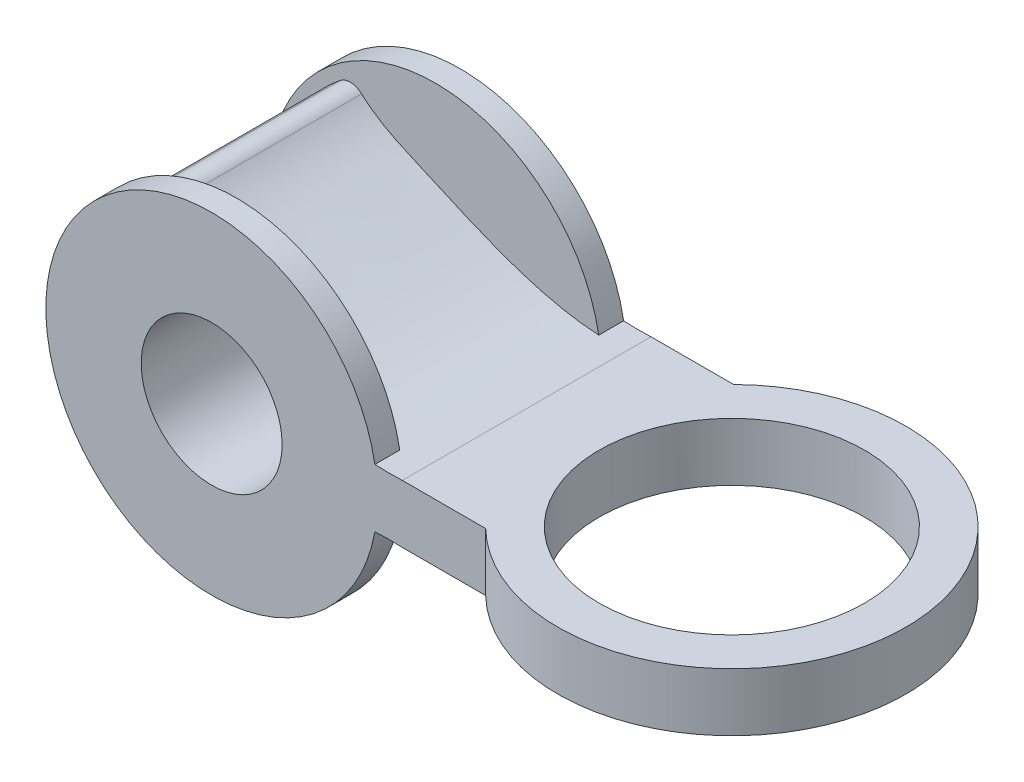
ISO-10303-21;
HEADER;
FILE_DESCRIPTION(('STEP AP214'),'2;1');
FILE_NAME('part.step','',(''),(''),'','','');
FILE_SCHEMA(('AUTOMOTIVE_DESIGN { 1 0 10303 214 1 1 1 1 }'));
ENDSEC;
DATA;
#1=APPLICATION_CONTEXT('core data for automotive mechanical design processes');
#2=APPLICATION_PROTOCOL_DEFINITION('international standard','automotive_design',2000,#1);
#3=PRODUCT_CONTEXT('',#1,'mechanical');
#4=PRODUCT('Part','Part','',(#3));
#5=PRODUCT_RELATED_PRODUCT_CATEGORY('part','',(#4));
#6=PRODUCT_DEFINITION_FORMATION('','',#4);
#7=PRODUCT_DEFINITION_CONTEXT('part definition',#1,'design');
#8=PRODUCT_DEFINITION('design','',#6,#7);
#9=PRODUCT_DEFINITION_SHAPE('','',#8);
#10=(LENGTH_UNIT() NAMED_UNIT(*) SI_UNIT(.MILLI.,.METRE.));
#11=(NAMED_UNIT(*) PLANE_ANGLE_UNIT() SI_UNIT($,.RADIAN.));
#12=(NAMED_UNIT(*) SI_UNIT($,.STERADIAN.) SOLID_ANGLE_UNIT());
#13=UNCERTAINTY_MEASURE_WITH_UNIT(LENGTH_MEASURE(1.E-05),#10,'distance_accuracy_value','');
#14=(GEOMETRIC_REPRESENTATION_CONTEXT(3) GLOBAL_UNCERTAINTY_ASSIGNED_CONTEXT((#13)) GLOBAL_UNIT_ASSIGNED_CONTEXT((#10,
#11,#12)) REPRESENTATION_CONTEXT('',''));
#15=CARTESIAN_POINT('',(0.,0.,0.));
#16=DIRECTION('',(0.,0.,1.));
#17=DIRECTION('',(1.,0.,0.));
#18=AXIS2_PLACEMENT_3D('',#15,#16,#17);
#19=CARTESIAN_POINT('',(0.,0.,-30.));
#20=DIRECTION('',(0.,0.,1.));
#21=DIRECTION('',(1.,0.,0.));
#22=AXIS2_PLACEMENT_3D('',#19,#20,#21);
#23=CYLINDRICAL_SURFACE('',#22,18.5332451256468);
#24=DIRECTION('',(0.,0.,1.));
#25=VECTOR('',#24,1.);
#26=CARTESIAN_POINT('',(-11.5154736588882,14.5215371534409,-30.));
#27=LINE('',#26,#25);
#28=CARTESIAN_POINT('',(-11.5154736588882,14.5215371534409,-3.));
#29=VERTEX_POINT('',#28);
#30=CARTESIAN_POINT('',(-11.5154736588882,14.5215371534409,-27.));
#31=VERTEX_POINT('',#30);
#32=EDGE_CURVE('E226',#29,#31,#27,.F.);
#33=ORIENTED_EDGE('',*,*,#32,.T.);
#34=CARTESIAN_POINT('',(0.,0.,-27.));
#35=DIRECTION('',(0.,0.,-1.));
#36=DIRECTION('',(-1.,0.,0.));
#37=AXIS2_PLACEMENT_3D('',#34,#35,#36);
#38=CIRCLE('',#37,18.5332451256468);
#39=CARTESIAN_POINT('',(-11.5154736588882,-14.5215371534409,-27.));
#40=VERTEX_POINT('',#39);
#41=EDGE_CURVE('E268',#31,#40,#38,.F.);
#42=ORIENTED_EDGE('',*,*,#41,.T.);
#43=DIRECTION('',(0.,0.,1.));
#44=VECTOR('',#43,1.);
#45=CARTESIAN_POINT('',(-11.5154736588882,-14.5215371534409,-30.));
#46=LINE('',#45,#44);
#47=CARTESIAN_POINT('',(-11.5154736588882,-14.5215371534409,-3.));
#48=VERTEX_POINT('',#47);
#49=EDGE_CURVE('E65',#40,#48,#46,.T.);
#50=ORIENTED_EDGE('',*,*,#49,.T.);
#51=CARTESIAN_POINT('',(0.,0.,-3.));
#52=DIRECTION('',(0.,0.,1.));
#53=DIRECTION('',(1.,0.,0.));
#54=AXIS2_PLACEMENT_3D('',#51,#52,#53);
#55=CIRCLE('',#54,18.5332451256468);
#56=EDGE_CURVE('E338',#29,#48,#55,.T.);
#57=ORIENTED_EDGE('',*,*,#56,.F.);
#58=EDGE_LOOP('',(#33,#42,#50,#57));
#59=FACE_BOUND('',#58,.T.);
#60=ADVANCED_FACE('F39',(#59),#23,.T.);
#61=CARTESIAN_POINT('',(-10.2727907309046,12.9544573403815,-16.5));
#62=DIRECTION('',(0.,0.,1.));
#63=DIRECTION('',(1.,0.,0.));
#64=AXIS2_PLACEMENT_3D('',#61,#62,#63);
#65=CYLINDRICAL_SURFACE('',#64,2.);
#66=DIRECTION('',(0.,0.,1.));
#67=VECTOR('',#66,1.);
#68=CARTESIAN_POINT('',(-8.90822627606835,14.416635116371,-30.));
#69=LINE('',#68,#67);
#70=CARTESIAN_POINT('',(-8.90822627606835,14.416635116371,-27.));
#71=VERTEX_POINT('',#70);
#72=CARTESIAN_POINT('',(-8.90822627606835,14.416635116371,-3.));
#73=VERTEX_POINT('',#72);
#74=EDGE_CURVE('E215',#71,#73,#69,.T.);
#75=ORIENTED_EDGE('',*,*,#74,.F.);
#76=CARTESIAN_POINT('',(-10.2727907309046,12.9544573403815,-27.));
#77=DIRECTION('',(0.,0.,-1.));
#78=DIRECTION('',(-1.,0.,0.));
#79=AXIS2_PLACEMENT_3D('',#76,#77,#78);
#80=CIRCLE('',#79,2.);
#81=EDGE_CURVE('E217',#71,#31,#80,.F.);
#82=ORIENTED_EDGE('',*,*,#81,.T.);
#83=ORIENTED_EDGE('',*,*,#32,.F.);
#84=CARTESIAN_POINT('',(-10.2727907309046,12.9544573403815,-3.));
#85=DIRECTION('',(0.,0.,1.));
#86=DIRECTION('',(1.,0.,0.));
#87=AXIS2_PLACEMENT_3D('',#84,#85,#86);
#88=CIRCLE('',#87,2.);
#89=EDGE_CURVE('E219',#73,#29,#88,.T.);
#90=ORIENTED_EDGE('',*,*,#89,.F.);
#91=EDGE_LOOP('',(#75,#82,#83,#90));
#92=FACE_BOUND('',#91,.T.);
#93=ADVANCED_FACE('F204',(#92),#65,.T.);
#94=CARTESIAN_POINT('',(-10.2727907309046,-12.9544573403816,-16.5));
#95=DIRECTION('',(0.,0.,1.));
#96=DIRECTION('',(1.,0.,0.));
#97=AXIS2_PLACEMENT_3D('',#94,#95,#96);
#98=CYLINDRICAL_SURFACE('',#97,2.);
#99=ORIENTED_EDGE('',*,*,#49,.F.);
#100=CARTESIAN_POINT('',(-10.2727907309046,-12.9544573403816,-27.));
#101=DIRECTION('',(0.,0.,-1.));
#102=DIRECTION('',(-1.,0.,0.));
#103=AXIS2_PLACEMENT_3D('',#100,#101,#102);
#104=CIRCLE('',#103,2.);
#105=CARTESIAN_POINT('',(-8.90822627606836,-14.416635116371,-27.));
#106=VERTEX_POINT('',#105);
#107=EDGE_CURVE('E11',#40,#106,#104,.F.);
#108=ORIENTED_EDGE('',*,*,#107,.T.);
#109=DIRECTION('',(0.,0.,1.));
#110=VECTOR('',#109,1.);
#111=CARTESIAN_POINT('',(-8.90822627606837,-14.416635116371,-3.));
#112=LINE('',#111,#110);
#113=CARTESIAN_POINT('',(-8.90822627606836,-14.416635116371,-3.));
#114=VERTEX_POINT('',#113);
#115=EDGE_CURVE('E235',#114,#106,#112,.F.);
#116=ORIENTED_EDGE('',*,*,#115,.F.);
#117=CARTESIAN_POINT('',(-10.2727907309046,-12.9544573403816,-3.));
#118=DIRECTION('',(0.,0.,1.));
#119=DIRECTION('',(1.,0.,0.));
#120=AXIS2_PLACEMENT_3D('',#117,#118,#119);
#121=CIRCLE('',#120,2.);
#122=EDGE_CURVE('E57',#48,#114,#121,.T.);
#123=ORIENTED_EDGE('',*,*,#122,.F.);
#124=EDGE_LOOP('',(#99,#108,#116,#123));
#125=FACE_BOUND('',#124,.T.);
#126=ADVANCED_FACE('F41',(#125),#98,.T.);
#127=CARTESIAN_POINT('',(0.,0.,-3.));
#128=DIRECTION('',(0.,0.,1.));
#129=DIRECTION('',(1.,0.,0.));
#130=AXIS2_PLACEMENT_3D('',#127,#128,#129);
#131=CYLINDRICAL_SURFACE('',#130,20.);
#132=DIRECTION('',(0.,0.,1.));
#133=VECTOR('',#132,1.);
#134=CARTESIAN_POINT('',(19.6880187341275,-3.51879501031881,-30.));
#135=LINE('',#134,#133);
#136=CARTESIAN_POINT('',(19.6880187341275,-3.51879501031881,0.));
#137=VERTEX_POINT('',#136);
#138=CARTESIAN_POINT('',(19.6880187341275,-3.51879501031881,-3.));
#139=VERTEX_POINT('',#138);
#140=EDGE_CURVE('E346',#137,#139,#135,.F.);
#141=ORIENTED_EDGE('',*,*,#140,.F.);
#142=CARTESIAN_POINT('',(0.,0.,0.));
#143=DIRECTION('',(0.,0.,1.));
#144=DIRECTION('',(1.,0.,0.));
#145=AXIS2_PLACEMENT_3D('',#142,#143,#144);
#146=CIRCLE('',#145,20.);
#147=CARTESIAN_POINT('',(19.6880187341275,3.51879501031881,0.));
#148=VERTEX_POINT('',#147);
#149=EDGE_CURVE('E229',#148,#137,#146,.T.);
#150=ORIENTED_EDGE('',*,*,#149,.F.);
#151=DIRECTION('',(0.,0.,1.));
#152=VECTOR('',#151,1.);
#153=CARTESIAN_POINT('',(19.6880187341275,3.51879501031881,-30.));
#154=LINE('',#153,#152);
#155=CARTESIAN_POINT('',(19.6880187341275,3.51879501031881,-3.));
#156=VERTEX_POINT('',#155);
#157=EDGE_CURVE('E332',#156,#148,#154,.T.);
#158=ORIENTED_EDGE('',*,*,#157,.F.);
#159=CARTESIAN_POINT('',(0.,0.,-3.));
#160=DIRECTION('',(0.,0.,1.));
#161=DIRECTION('',(1.,0.,0.));
#162=AXIS2_PLACEMENT_3D('',#159,#160,#161);
#163=CIRCLE('',#162,20.);
#164=EDGE_CURVE('E222',#156,#139,#163,.T.);
#165=ORIENTED_EDGE('',*,*,#164,.T.);
#166=EDGE_LOOP('',(#141,#150,#158,#165));
#167=FACE_BOUND('',#166,.T.);
#168=ADVANCED_FACE('F197',(#167),#131,.T.);
#169=CARTESIAN_POINT('',(0.,0.,-3.));
#170=DIRECTION('',(0.,0.,1.));
#171=DIRECTION('',(1.,0.,0.));
#172=AXIS2_PLACEMENT_3D('',#169,#170,#171);
#173=PLANE('',#172);
#174=CARTESIAN_POINT('',(22.9951896370363,3.5,-3.));
#175=CARTESIAN_POINT('',(13.8331554863839,3.05258589155144,-3.));
#176=CARTESIAN_POINT('',(3.18858359263504,8.31405084999522,-3.));
#177=CARTESIAN_POINT('',(-7.82011813479839,12.9045693588074,-3.));
#178=CARTESIAN_POINT('',(-10.0122596027287,15.596019765789,-3.));
#179=B_SPLINE_CURVE_WITH_KNOTS('',3,(#174,#175,#176,#177,#178),.UNSPECIFIED.,.F.,.F.,(4,1,4),
(0.,0.723511581759915,1.),.UNSPECIFIED.);
#180=EDGE_CURVE('E325',#156,#73,#179,.T.);
#181=ORIENTED_EDGE('',*,*,#180,.T.);
#182=ORIENTED_EDGE('',*,*,#89,.T.);
#183=ORIENTED_EDGE('',*,*,#56,.T.);
#184=ORIENTED_EDGE('',*,*,#122,.T.);
#185=CARTESIAN_POINT('',(-10.0122596027287,-15.596019765789,-3.));
#186=CARTESIAN_POINT('',(-7.82011813479838,-12.9045693588075,-3.));
#187=CARTESIAN_POINT('',(3.18858359263503,-8.31405084999522,-3.));
#188=CARTESIAN_POINT('',(13.8331554863839,-3.05258589155144,-3.));
#189=CARTESIAN_POINT('',(22.9951896370363,-3.5,-3.));
#190=B_SPLINE_CURVE_WITH_KNOTS('',3,(#185,#186,#187,#188,#189),.UNSPECIFIED.,.F.,.F.,(4,1,4),
(0.,0.276488418240085,1.),.UNSPECIFIED.);
#191=EDGE_CURVE('E341',#114,#139,#190,.T.);
#192=ORIENTED_EDGE('',*,*,#191,.T.);
#193=ORIENTED_EDGE('',*,*,#164,.F.);
#194=EDGE_LOOP('',(#181,#182,#183,#184,#192,#193));
#195=FACE_BOUND('',#194,.T.);
#196=ADVANCED_FACE('F193',(#195),#173,.F.);
#197=CARTESIAN_POINT('',(0.,0.,0.));
#198=DIRECTION('',(0.,0.,1.));
#199=DIRECTION('',(1.,0.,0.));
#200=AXIS2_PLACEMENT_3D('',#197,#198,#199);
#201=PLANE('',#200);
#202=CARTESIAN_POINT('',(0.,0.,0.));
#203=DIRECTION('',(0.,0.,1.));
#204=DIRECTION('',(1.,0.,0.));
#205=AXIS2_PLACEMENT_3D('',#202,#203,#204);
#206=CIRCLE('',#205,8.5);
#207=CARTESIAN_POINT('',(8.5,0.,0.));
#208=VERTEX_POINT('',#207);
#209=EDGE_CURVE('E247',#208,#208,#206,.T.);
#210=ORIENTED_EDGE('',*,*,#209,.F.);
#211=EDGE_LOOP('',(#210));
#212=FACE_BOUND('',#211,.T.);
#213=DIRECTION('',(0.,-1.,0.));
#214=VECTOR('',#213,1.);
#215=CARTESIAN_POINT('',(33.0496479144585,3.5,0.));
#216=LINE('',#215,#214);
#217=CARTESIAN_POINT('',(33.0496479144585,3.5,0.));
#218=VERTEX_POINT('',#217);
#219=CARTESIAN_POINT('',(33.0496479144585,-3.5,0.));
#220=VERTEX_POINT('',#219);
#221=EDGE_CURVE('E289',#218,#220,#216,.T.);
#222=ORIENTED_EDGE('',*,*,#221,.F.);
#223=DIRECTION('',(-1.,0.,0.));
#224=VECTOR('',#223,1.);
#225=CARTESIAN_POINT('',(22.9951896370363,3.5,0.));
#226=LINE('',#225,#224);
#227=CARTESIAN_POINT('',(22.9951896370363,3.5,0.));
#228=VERTEX_POINT('',#227);
#229=EDGE_CURVE('E293',#218,#228,#226,.T.);
#230=ORIENTED_EDGE('',*,*,#229,.T.);
#231=CARTESIAN_POINT('',(22.9951896370363,3.5,0.));
#232=CARTESIAN_POINT('',(13.8331554863839,3.05258589155144,0.));
#233=CARTESIAN_POINT('',(3.18858359263504,8.31405084999522,0.));
#234=CARTESIAN_POINT('',(-7.82011813479839,12.9045693588074,0.));
#235=CARTESIAN_POINT('',(-10.0122596027287,15.596019765789,0.));
#236=B_SPLINE_CURVE_WITH_KNOTS('',3,(#231,#232,#233,#234,#235),.UNSPECIFIED.,.F.,.F.,(4,1,4),
(0.,0.723511581759915,1.),.UNSPECIFIED.);
#237=EDGE_CURVE('E297',#228,#148,#236,.T.);
#238=ORIENTED_EDGE('',*,*,#237,.T.);
#239=ORIENTED_EDGE('',*,*,#149,.T.);
#240=CARTESIAN_POINT('',(-10.0122596027287,-15.596019765789,0.));
#241=CARTESIAN_POINT('',(-7.82011813479838,-12.9045693588075,0.));
#242=CARTESIAN_POINT('',(3.18858359263503,-8.31405084999522,0.));
#243=CARTESIAN_POINT('',(13.8331554863839,-3.05258589155144,0.));
#244=CARTESIAN_POINT('',(22.9951896370363,-3.5,0.));
#245=B_SPLINE_CURVE_WITH_KNOTS('',3,(#240,#241,#242,#243,#244),.UNSPECIFIED.,.F.,.F.,(4,1,4),
(0.,0.276488418240085,1.),.UNSPECIFIED.);
#246=CARTESIAN_POINT('',(22.9951896370363,-3.5,0.));
#247=VERTEX_POINT('',#246);
#248=EDGE_CURVE('E303',#137,#247,#245,.T.);
#249=ORIENTED_EDGE('',*,*,#248,.T.);
#250=DIRECTION('',(1.,0.,0.));
#251=VECTOR('',#250,1.);
#252=CARTESIAN_POINT('',(22.9951896370363,-3.5,0.));
#253=LINE('',#252,#251);
#254=EDGE_CURVE('E170',#247,#220,#253,.T.);
#255=ORIENTED_EDGE('',*,*,#254,.T.);
#256=EDGE_LOOP('',(#222,#230,#238,#239,#249,#255));
#257=FACE_BOUND('',#256,.T.);
#258=ADVANCED_FACE('F196',(#212,#257),#201,.T.);
#259=CARTESIAN_POINT('',(22.9951896370363,-3.5,-30.));
#260=DIRECTION('',(0.,-1.,0.));
#261=DIRECTION('',(1.,0.,0.));
#262=AXIS2_PLACEMENT_3D('',#259,#260,#261);
#263=PLANE('',#262);
#264=CARTESIAN_POINT('',(47.6997847970328,-3.5,-15.0457133204723));
#265=DIRECTION('',(0.,-1.,0.));
#266=DIRECTION('',(1.,0.,0.));
#267=AXIS2_PLACEMENT_3D('',#264,#265,#266);
#268=CIRCLE('',#267,16.);
#269=CARTESIAN_POINT('',(63.6997847970328,-3.5,-15.0457133204723));
#270=VERTEX_POINT('',#269);
#271=EDGE_CURVE('E257',#270,#270,#268,.T.);
#272=ORIENTED_EDGE('',*,*,#271,.F.);
#273=EDGE_LOOP('',(#272));
#274=FACE_BOUND('',#273,.T.);
#275=CARTESIAN_POINT('',(47.6997847970328,-3.5,-15.0457133204723));
#276=DIRECTION('',(0.,-1.,0.));
#277=DIRECTION('',(1.,0.,0.));
#278=AXIS2_PLACEMENT_3D('',#275,#276,#277);
#279=CIRCLE('',#278,21.);
#280=CARTESIAN_POINT('',(32.9563350682041,-3.5,-30.));
#281=VERTEX_POINT('',#280);
#282=EDGE_CURVE('E285',#281,#220,#279,.T.);
#283=ORIENTED_EDGE('',*,*,#282,.T.);
#284=ORIENTED_EDGE('',*,*,#254,.F.);
#285=DIRECTION('',(0.,0.,1.));
#286=VECTOR('',#285,1.);
#287=CARTESIAN_POINT('',(22.9951896370363,-3.5,-30.));
#288=LINE('',#287,#286);
#289=CARTESIAN_POINT('',(22.9951896370363,-3.5,-30.));
#290=VERTEX_POINT('',#289);
#291=EDGE_CURVE('E321',#290,#247,#288,.T.);
#292=ORIENTED_EDGE('',*,*,#291,.F.);
#293=DIRECTION('',(1.,0.,0.));
#294=VECTOR('',#293,1.);
#295=CARTESIAN_POINT('',(22.9951896370363,-3.5,-30.));
#296=LINE('',#295,#294);
#297=EDGE_CURVE('E168',#290,#281,#296,.T.);
#298=ORIENTED_EDGE('',*,*,#297,.T.);
#299=EDGE_LOOP('',(#283,#284,#292,#298));
#300=FACE_BOUND('',#299,.T.);
#301=ADVANCED_FACE('F200',(#274,#300),#263,.T.);
#302=CARTESIAN_POINT('',(-10.0122596027287,-15.596019765789,-30.));
#303=CARTESIAN_POINT('',(-7.82011813479838,-12.9045693588075,-30.));
#304=CARTESIAN_POINT('',(3.18858359263503,-8.31405084999522,-30.));
#305=CARTESIAN_POINT('',(13.8331554863839,-3.05258589155144,-30.));
#306=CARTESIAN_POINT('',(22.9951896370363,-3.5,-30.));
#307=B_SPLINE_CURVE_WITH_KNOTS('',3,(#302,#303,#304,#305,#306),.UNSPECIFIED.,.F.,.F.,(4,1,4),
(0.,0.276488418240085,1.),.UNSPECIFIED.);
#308=DIRECTION('',(0.,0.,1.));
#309=VECTOR('',#308,1.);
#310=SURFACE_OF_LINEAR_EXTRUSION('',#307,#309);
#311=DIRECTION('',(0.,0.,1.));
#312=VECTOR('',#311,1.);
#313=CARTESIAN_POINT('',(19.6880187341275,-3.51879501031881,-30.));
#314=LINE('',#313,#312);
#315=CARTESIAN_POINT('',(19.6880187341275,-3.51879501031881,-30.));
#316=VERTEX_POINT('',#315);
#317=CARTESIAN_POINT('',(19.6880187341275,-3.51879501031881,-27.));
#318=VERTEX_POINT('',#317);
#319=EDGE_CURVE('E144',#316,#318,#314,.T.);
#320=ORIENTED_EDGE('',*,*,#319,.F.);
#321=EDGE_CURVE('E154',#316,#290,#307,.T.);
#322=ORIENTED_EDGE('',*,*,#321,.T.);
#323=ORIENTED_EDGE('',*,*,#291,.T.);
#324=ORIENTED_EDGE('',*,*,#248,.F.);
#325=ORIENTED_EDGE('',*,*,#140,.T.);
#326=ORIENTED_EDGE('',*,*,#191,.F.);
#327=ORIENTED_EDGE('',*,*,#115,.T.);
#328=CARTESIAN_POINT('',(-10.0122596027287,-15.596019765789,-27.));
#329=CARTESIAN_POINT('',(-7.82011813479838,-12.9045693588075,-27.));
#330=CARTESIAN_POINT('',(3.18858359263503,-8.31405084999522,-27.));
#331=CARTESIAN_POINT('',(13.8331554863839,-3.05258589155144,-27.));
#332=CARTESIAN_POINT('',(22.9951896370363,-3.5,-27.));
#333=B_SPLINE_CURVE_WITH_KNOTS('',3,(#328,#329,#330,#331,#332),.UNSPECIFIED.,.F.,.F.,(4,1,4),
(0.,0.276488418240085,1.),.UNSPECIFIED.);
#334=EDGE_CURVE('E261',#106,#318,#333,.T.);
#335=ORIENTED_EDGE('',*,*,#334,.T.);
#336=EDGE_LOOP('',(#320,#322,#323,#324,#325,#326,#327,#335));
#337=FACE_BOUND('',#336,.T.);
#338=ADVANCED_FACE('F188',(#337),#310,.T.);
#339=CARTESIAN_POINT('',(22.9951896370363,3.5,-30.));
#340=CARTESIAN_POINT('',(13.8331554863839,3.05258589155144,-30.));
#341=CARTESIAN_POINT('',(3.18858359263504,8.31405084999522,-30.));
#342=CARTESIAN_POINT('',(-7.82011813479839,12.9045693588074,-30.));
#343=CARTESIAN_POINT('',(-10.0122596027287,15.596019765789,-30.));
#344=B_SPLINE_CURVE_WITH_KNOTS('',3,(#339,#340,#341,#342,#343),.UNSPECIFIED.,.F.,.F.,(4,1,4),
(0.,0.723511581759915,1.),.UNSPECIFIED.);
#345=DIRECTION('',(0.,0.,1.));
#346=VECTOR('',#345,1.);
#347=SURFACE_OF_LINEAR_EXTRUSION('',#344,#346);
#348=DIRECTION('',(0.,0.,1.));
#349=VECTOR('',#348,1.);
#350=CARTESIAN_POINT('',(19.6880187341275,3.51879501031881,-30.));
#351=LINE('',#350,#349);
#352=CARTESIAN_POINT('',(19.6880187341275,3.51879501031881,-27.));
#353=VERTEX_POINT('',#352);
#354=CARTESIAN_POINT('',(19.6880187341275,3.51879501031881,-30.));
#355=VERTEX_POINT('',#354);
#356=EDGE_CURVE('E133',#353,#355,#351,.F.);
#357=ORIENTED_EDGE('',*,*,#356,.F.);
#358=CARTESIAN_POINT('',(22.9951896370363,3.5,-27.));
#359=CARTESIAN_POINT('',(13.8331554863839,3.05258589155144,-27.));
#360=CARTESIAN_POINT('',(3.18858359263504,8.31405084999522,-27.));
#361=CARTESIAN_POINT('',(-7.82011813479839,12.9045693588074,-27.));
#362=CARTESIAN_POINT('',(-10.0122596027287,15.596019765789,-27.));
#363=B_SPLINE_CURVE_WITH_KNOTS('',3,(#358,#359,#360,#361,#362),.UNSPECIFIED.,.F.,.F.,(4,1,4),
(0.,0.723511581759915,1.),.UNSPECIFIED.);
#364=EDGE_CURVE('E145',#353,#71,#363,.T.);
#365=ORIENTED_EDGE('',*,*,#364,.T.);
#366=ORIENTED_EDGE('',*,*,#74,.T.);
#367=ORIENTED_EDGE('',*,*,#180,.F.);
#368=ORIENTED_EDGE('',*,*,#157,.T.);
#369=ORIENTED_EDGE('',*,*,#237,.F.);
#370=DIRECTION('',(0.,0.,1.));
#371=VECTOR('',#370,1.);
#372=CARTESIAN_POINT('',(22.9951896370363,3.5,-30.));
#373=LINE('',#372,#371);
#374=CARTESIAN_POINT('',(22.9951896370363,3.5,-30.));
#375=VERTEX_POINT('',#374);
#376=EDGE_CURVE('E162',#375,#228,#373,.T.);
#377=ORIENTED_EDGE('',*,*,#376,.F.);
#378=EDGE_CURVE('E152',#375,#355,#344,.T.);
#379=ORIENTED_EDGE('',*,*,#378,.T.);
#380=EDGE_LOOP('',(#357,#365,#366,#367,#368,#369,#377,#379));
#381=FACE_BOUND('',#380,.T.);
#382=ADVANCED_FACE('F159',(#381),#347,.T.);
#383=CARTESIAN_POINT('',(22.9951896370363,3.5,-30.));
#384=DIRECTION('',(0.,1.,0.));
#385=DIRECTION('',(0.,0.,1.));
#386=AXIS2_PLACEMENT_3D('',#383,#384,#385);
#387=PLANE('',#386);
#388=CARTESIAN_POINT('',(47.6997847970328,3.5,-15.0457133204723));
#389=DIRECTION('',(0.,1.,0.));
#390=DIRECTION('',(0.,0.,1.));
#391=AXIS2_PLACEMENT_3D('',#388,#389,#390);
#392=CIRCLE('',#391,16.);
#393=CARTESIAN_POINT('',(47.6997847970328,3.5,0.954286679527714));
#394=VERTEX_POINT('',#393);
#395=EDGE_CURVE('E43',#394,#394,#392,.T.);
#396=ORIENTED_EDGE('',*,*,#395,.F.);
#397=EDGE_LOOP('',(#396));
#398=FACE_BOUND('',#397,.T.);
#399=ORIENTED_EDGE('',*,*,#229,.F.);
#400=CARTESIAN_POINT('',(47.6997847970328,3.5,-15.0457133204723));
#401=DIRECTION('',(0.,-1.,0.));
#402=DIRECTION('',(1.,0.,0.));
#403=AXIS2_PLACEMENT_3D('',#400,#401,#402);
#404=CIRCLE('',#403,21.);
#405=CARTESIAN_POINT('',(32.9563350682041,3.5,-30.));
#406=VERTEX_POINT('',#405);
#407=EDGE_CURVE('E286',#406,#218,#404,.T.);
#408=ORIENTED_EDGE('',*,*,#407,.F.);
#409=DIRECTION('',(-1.,0.,0.));
#410=VECTOR('',#409,1.);
#411=CARTESIAN_POINT('',(22.9951896370363,3.5,-30.));
#412=LINE('',#411,#410);
#413=EDGE_CURVE('E164',#406,#375,#412,.T.);
#414=ORIENTED_EDGE('',*,*,#413,.T.);
#415=ORIENTED_EDGE('',*,*,#376,.T.);
#416=EDGE_LOOP('',(#399,#408,#414,#415));
#417=FACE_BOUND('',#416,.T.);
#418=ADVANCED_FACE('F187',(#398,#417),#387,.T.);
#419=CARTESIAN_POINT('',(5.54791951884021,-7.14755672666964,-30.));
#420=DIRECTION('',(0.,0.,1.));
#421=DIRECTION('',(1.,0.,0.));
#422=AXIS2_PLACEMENT_3D('',#419,#420,#421);
#423=PLANE('',#422);
#424=CARTESIAN_POINT('',(0.,0.,-30.));
#425=DIRECTION('',(0.,0.,1.));
#426=DIRECTION('',(1.,0.,0.));
#427=AXIS2_PLACEMENT_3D('',#424,#425,#426);
#428=CIRCLE('',#427,8.5);
#429=CARTESIAN_POINT('',(8.5,0.,-30.));
#430=VERTEX_POINT('',#429);
#431=EDGE_CURVE('E156',#430,#430,#428,.T.);
#432=ORIENTED_EDGE('',*,*,#431,.T.);
#433=EDGE_LOOP('',(#432));
#434=FACE_BOUND('',#433,.T.);
#435=ORIENTED_EDGE('',*,*,#321,.F.);
#436=CARTESIAN_POINT('',(0.,0.,-30.));
#437=DIRECTION('',(0.,0.,-1.));
#438=DIRECTION('',(-1.,0.,0.));
#439=AXIS2_PLACEMENT_3D('',#436,#437,#438);
#440=CIRCLE('',#439,20.);
#441=EDGE_CURVE('E136',#316,#355,#440,.T.);
#442=ORIENTED_EDGE('',*,*,#441,.T.);
#443=ORIENTED_EDGE('',*,*,#378,.F.);
#444=ORIENTED_EDGE('',*,*,#413,.F.);
#445=DIRECTION('',(0.,-1.,0.));
#446=VECTOR('',#445,1.);
#447=CARTESIAN_POINT('',(32.9563350682041,3.5,-30.));
#448=LINE('',#447,#446);
#449=EDGE_CURVE('E49',#406,#281,#448,.T.);
#450=ORIENTED_EDGE('',*,*,#449,.T.);
#451=ORIENTED_EDGE('',*,*,#297,.F.);
#452=EDGE_LOOP('',(#435,#442,#443,#444,#450,#451));
#453=FACE_BOUND('',#452,.T.);
#454=ADVANCED_FACE('F150',(#434,#453),#423,.F.);
#455=CARTESIAN_POINT('',(47.6997847970328,3.5,-15.0457133204723));
#456=DIRECTION('',(0.,-1.,0.));
#457=DIRECTION('',(1.,0.,0.));
#458=AXIS2_PLACEMENT_3D('',#455,#456,#457);
#459=CYLINDRICAL_SURFACE('',#458,21.);
#460=ORIENTED_EDGE('',*,*,#407,.T.);
#461=ORIENTED_EDGE('',*,*,#221,.T.);
#462=ORIENTED_EDGE('',*,*,#282,.F.);
#463=ORIENTED_EDGE('',*,*,#449,.F.);
#464=EDGE_LOOP('',(#460,#461,#462,#463));
#465=FACE_BOUND('',#464,.T.);
#466=ADVANCED_FACE('F368',(#465),#459,.T.);
#467=CARTESIAN_POINT('',(0.,0.,-27.));
#468=DIRECTION('',(0.,0.,-1.));
#469=DIRECTION('',(-1.,0.,0.));
#470=AXIS2_PLACEMENT_3D('',#467,#468,#469);
#471=CYLINDRICAL_SURFACE('',#470,20.);
#472=ORIENTED_EDGE('',*,*,#441,.F.);
#473=ORIENTED_EDGE('',*,*,#319,.T.);
#474=CARTESIAN_POINT('',(0.,0.,-27.));
#475=DIRECTION('',(0.,0.,-1.));
#476=DIRECTION('',(-1.,0.,0.));
#477=AXIS2_PLACEMENT_3D('',#474,#475,#476);
#478=CIRCLE('',#477,20.);
#479=EDGE_CURVE('E139',#318,#353,#478,.T.);
#480=ORIENTED_EDGE('',*,*,#479,.T.);
#481=ORIENTED_EDGE('',*,*,#356,.T.);
#482=EDGE_LOOP('',(#472,#473,#480,#481));
#483=FACE_BOUND('',#482,.T.);
#484=ADVANCED_FACE('F135',(#483),#471,.T.);
#485=CARTESIAN_POINT('',(0.,0.,-27.));
#486=DIRECTION('',(0.,0.,-1.));
#487=DIRECTION('',(-1.,0.,0.));
#488=AXIS2_PLACEMENT_3D('',#485,#486,#487);
#489=PLANE('',#488);
#490=ORIENTED_EDGE('',*,*,#364,.F.);
#491=ORIENTED_EDGE('',*,*,#479,.F.);
#492=ORIENTED_EDGE('',*,*,#334,.F.);
#493=ORIENTED_EDGE('',*,*,#107,.F.);
#494=ORIENTED_EDGE('',*,*,#41,.F.);
#495=ORIENTED_EDGE('',*,*,#81,.F.);
#496=EDGE_LOOP('',(#490,#491,#492,#493,#494,#495));
#497=FACE_BOUND('',#496,.T.);
#498=ADVANCED_FACE('F361',(#497),#489,.F.);
#499=CARTESIAN_POINT('',(0.,0.,-43.));
#500=DIRECTION('',(0.,0.,1.));
#501=DIRECTION('',(1.,0.,0.));
#502=AXIS2_PLACEMENT_3D('',#499,#500,#501);
#503=CYLINDRICAL_SURFACE('',#502,8.5);
#504=ORIENTED_EDGE('',*,*,#209,.T.);
#505=EDGE_LOOP('',(#504));
#506=FACE_BOUND('',#505,.T.);
#507=ORIENTED_EDGE('',*,*,#431,.F.);
#508=EDGE_LOOP('',(#507));
#509=FACE_BOUND('',#508,.T.);
#510=ADVANCED_FACE('F414',(#506,#509),#503,.F.);
#511=CARTESIAN_POINT('',(47.6997847970328,39.5,-15.0457133204723));
#512=DIRECTION('',(0.,-1.,0.));
#513=DIRECTION('',(1.,0.,0.));
#514=AXIS2_PLACEMENT_3D('',#511,#512,#513);
#515=CYLINDRICAL_SURFACE('',#514,16.);
#516=ORIENTED_EDGE('',*,*,#395,.T.);
#517=EDGE_LOOP('',(#516));
#518=FACE_BOUND('',#517,.T.);
#519=ORIENTED_EDGE('',*,*,#271,.T.);
#520=EDGE_LOOP('',(#519));
#521=FACE_BOUND('',#520,.T.);
#522=ADVANCED_FACE('F418',(#518,#521),#515,.F.);
#523=CLOSED_SHELL('',(#60,#93,#126,#168,#196,#258,#301,#338,#382,#418,#454,#466,#484,#498,#510,#522));
#524=MANIFOLD_SOLID_BREP('B2',#523);
#525=ADVANCED_BREP_SHAPE_REPRESENTATION('',(#18,#524),#14);
#526=SHAPE_DEFINITION_REPRESENTATION(#9,#525);
ENDSEC;
END-ISO-10303-21;
